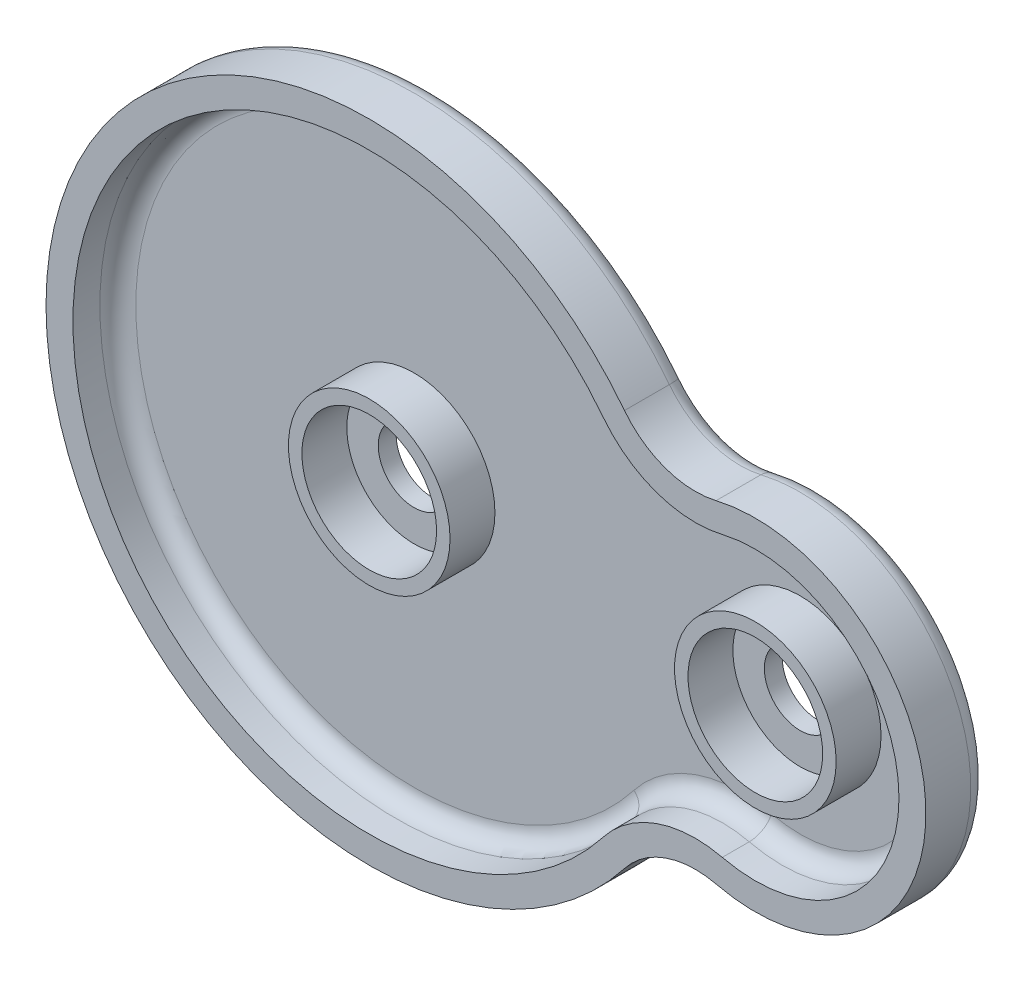
ISO-10303-21;
HEADER;
FILE_DESCRIPTION(('STEP AP214'),'2;1');
FILE_NAME('part.step','',(''),(''),'','','');
FILE_SCHEMA(('AUTOMOTIVE_DESIGN { 1 0 10303 214 1 1 1 1 }'));
ENDSEC;
DATA;
#1=APPLICATION_CONTEXT('core data for automotive mechanical design processes');
#2=APPLICATION_PROTOCOL_DEFINITION('international standard','automotive_design',2000,#1);
#3=PRODUCT_CONTEXT('',#1,'mechanical');
#4=PRODUCT('Part','Part','',(#3));
#5=PRODUCT_RELATED_PRODUCT_CATEGORY('part','',(#4));
#6=PRODUCT_DEFINITION_FORMATION('','',#4);
#7=PRODUCT_DEFINITION_CONTEXT('part definition',#1,'design');
#8=PRODUCT_DEFINITION('design','',#6,#7);
#9=PRODUCT_DEFINITION_SHAPE('','',#8);
#10=(LENGTH_UNIT() NAMED_UNIT(*) SI_UNIT(.MILLI.,.METRE.));
#11=(NAMED_UNIT(*) PLANE_ANGLE_UNIT() SI_UNIT($,.RADIAN.));
#12=(NAMED_UNIT(*) SI_UNIT($,.STERADIAN.) SOLID_ANGLE_UNIT());
#13=UNCERTAINTY_MEASURE_WITH_UNIT(LENGTH_MEASURE(1.E-05),#10,'distance_accuracy_value','');
#14=(GEOMETRIC_REPRESENTATION_CONTEXT(3) GLOBAL_UNCERTAINTY_ASSIGNED_CONTEXT((#13)) GLOBAL_UNIT_ASSIGNED_CONTEXT((#10,
#11,#12)) REPRESENTATION_CONTEXT('',''));
#15=CARTESIAN_POINT('',(0.,0.,0.));
#16=DIRECTION('',(0.,0.,1.));
#17=DIRECTION('',(1.,0.,0.));
#18=AXIS2_PLACEMENT_3D('',#15,#16,#17);
#19=CARTESIAN_POINT('',(0.,0.,2.));
#20=DIRECTION('',(0.,0.,1.));
#21=DIRECTION('',(1.,0.,0.));
#22=AXIS2_PLACEMENT_3D('',#19,#20,#21);
#23=PLANE('',#22);
#24=CARTESIAN_POINT('',(43.,0.,2.));
#25=DIRECTION('',(0.,0.,1.));
#26=DIRECTION('',(1.,0.,0.));
#27=AXIS2_PLACEMENT_3D('',#24,#25,#26);
#28=CIRCLE('',#27,4.);
#29=CARTESIAN_POINT('',(47.,0.,2.));
#30=VERTEX_POINT('',#29);
#31=EDGE_CURVE('E214',#30,#30,#28,.T.);
#32=ORIENTED_EDGE('',*,*,#31,.F.);
#33=EDGE_LOOP('',(#32));
#34=FACE_BOUND('',#33,.T.);
#35=CARTESIAN_POINT('',(43.,0.,2.));
#36=DIRECTION('',(0.,0.,1.));
#37=DIRECTION('',(1.,0.,0.));
#38=AXIS2_PLACEMENT_3D('',#35,#36,#37);
#39=CIRCLE('',#38,7.5);
#40=CARTESIAN_POINT('',(50.5,0.,2.));
#41=VERTEX_POINT('',#40);
#42=EDGE_CURVE('E196',#41,#41,#39,.F.);
#43=ORIENTED_EDGE('',*,*,#42,.F.);
#44=EDGE_LOOP('',(#43));
#45=FACE_BOUND('',#44,.T.);
#46=ADVANCED_FACE('F40',(#34,#45),#23,.T.);
#47=CARTESIAN_POINT('',(0.,0.,2.));
#48=DIRECTION('',(0.,0.,1.));
#49=DIRECTION('',(1.,0.,0.));
#50=AXIS2_PLACEMENT_3D('',#47,#48,#49);
#51=CIRCLE('',#50,4.);
#52=CARTESIAN_POINT('',(4.,0.,2.));
#53=VERTEX_POINT('',#52);
#54=EDGE_CURVE('E211',#53,#53,#51,.T.);
#55=ORIENTED_EDGE('',*,*,#54,.F.);
#56=EDGE_LOOP('',(#55));
#57=FACE_BOUND('',#56,.T.);
#58=CARTESIAN_POINT('',(0.,0.,2.));
#59=DIRECTION('',(0.,0.,1.));
#60=DIRECTION('',(1.,0.,0.));
#61=AXIS2_PLACEMENT_3D('',#58,#59,#60);
#62=CIRCLE('',#61,7.5);
#63=CARTESIAN_POINT('',(7.5,0.,2.));
#64=VERTEX_POINT('',#63);
#65=EDGE_CURVE('E141',#64,#64,#62,.F.);
#66=ORIENTED_EDGE('',*,*,#65,.F.);
#67=EDGE_LOOP('',(#66));
#68=FACE_BOUND('',#67,.T.);
#69=ADVANCED_FACE('F310',(#57,#68),#23,.T.);
#70=CARTESIAN_POINT('',(36.3255813953488,28.2214835947703,2.));
#71=DIRECTION('',(0.,0.,-1.));
#72=DIRECTION('',(-1.,0.,0.));
#73=AXIS2_PLACEMENT_3D('',#70,#71,#72);
#74=CYLINDRICAL_SURFACE('',#73,10.);
#75=DIRECTION('',(0.,0.,-1.));
#76=VECTOR('',#75,1.);
#77=CARTESIAN_POINT('',(38.6271050521251,18.4899375276081,2.));
#78=LINE('',#77,#76);
#79=CARTESIAN_POINT('',(38.6271050521251,18.4899375276081,7.));
#80=VERTEX_POINT('',#79);
#81=CARTESIAN_POINT('',(38.6271050521251,18.4899375276081,2.));
#82=VERTEX_POINT('',#81);
#83=EDGE_CURVE('E218',#80,#82,#78,.T.);
#84=ORIENTED_EDGE('',*,*,#83,.T.);
#85=CARTESIAN_POINT('',(36.3255813953488,28.2214835947703,2.));
#86=DIRECTION('',(0.,0.,1.));
#87=DIRECTION('',(1.,0.,0.));
#88=AXIS2_PLACEMENT_3D('',#85,#86,#87);
#89=CIRCLE('',#88,10.);
#90=CARTESIAN_POINT('',(28.4287158746208,22.0863784654724,2.));
#91=VERTEX_POINT('',#90);
#92=EDGE_CURVE('E138',#82,#91,#89,.F.);
#93=ORIENTED_EDGE('',*,*,#92,.T.);
#94=DIRECTION('',(0.,0.,-1.));
#95=VECTOR('',#94,1.);
#96=CARTESIAN_POINT('',(28.4287158746208,22.0863784654724,2.));
#97=LINE('',#96,#95);
#98=CARTESIAN_POINT('',(28.4287158746208,22.0863784654724,7.));
#99=VERTEX_POINT('',#98);
#100=EDGE_CURVE('E131',#99,#91,#97,.T.);
#101=ORIENTED_EDGE('',*,*,#100,.F.);
#102=CARTESIAN_POINT('',(36.3255813953488,28.2214835947703,7.));
#103=DIRECTION('',(0.,0.,1.));
#104=DIRECTION('',(1.,0.,0.));
#105=AXIS2_PLACEMENT_3D('',#102,#103,#104);
#106=CIRCLE('',#105,10.);
#107=EDGE_CURVE('E136',#99,#80,#106,.T.);
#108=ORIENTED_EDGE('',*,*,#107,.T.);
#109=EDGE_LOOP('',(#84,#93,#101,#108));
#110=FACE_BOUND('',#109,.T.);
#111=ADVANCED_FACE('F134',(#110),#74,.F.);
#112=CARTESIAN_POINT('',(0.,0.,2.));
#113=DIRECTION('',(0.,0.,-1.));
#114=DIRECTION('',(-1.,0.,0.));
#115=AXIS2_PLACEMENT_3D('',#112,#113,#114);
#116=CYLINDRICAL_SURFACE('',#115,36.);
#117=ORIENTED_EDGE('',*,*,#100,.T.);
#118=CARTESIAN_POINT('',(0.,0.,2.));
#119=DIRECTION('',(0.,0.,1.));
#120=DIRECTION('',(1.,0.,0.));
#121=AXIS2_PLACEMENT_3D('',#118,#119,#120);
#122=CIRCLE('',#121,36.);
#123=CARTESIAN_POINT('',(28.4287158746208,-22.0863784654724,2.));
#124=VERTEX_POINT('',#123);
#125=EDGE_CURVE('E239',#91,#124,#122,.T.);
#126=ORIENTED_EDGE('',*,*,#125,.T.);
#127=DIRECTION('',(0.,0.,-1.));
#128=VECTOR('',#127,1.);
#129=CARTESIAN_POINT('',(28.4287158746208,-22.0863784654724,2.));
#130=LINE('',#129,#128);
#131=CARTESIAN_POINT('',(28.4287158746208,-22.0863784654724,7.));
#132=VERTEX_POINT('',#131);
#133=EDGE_CURVE('E142',#132,#124,#130,.T.);
#134=ORIENTED_EDGE('',*,*,#133,.F.);
#135=CARTESIAN_POINT('',(0.,0.,7.));
#136=DIRECTION('',(0.,0.,1.));
#137=DIRECTION('',(1.,0.,0.));
#138=AXIS2_PLACEMENT_3D('',#135,#136,#137);
#139=CIRCLE('',#138,36.);
#140=EDGE_CURVE('E145',#99,#132,#139,.T.);
#141=ORIENTED_EDGE('',*,*,#140,.F.);
#142=EDGE_LOOP('',(#117,#126,#134,#141));
#143=FACE_BOUND('',#142,.T.);
#144=ADVANCED_FACE('F146',(#143),#116,.T.);
#145=CARTESIAN_POINT('',(36.3255813953488,-28.2214835947703,2.));
#146=DIRECTION('',(0.,0.,-1.));
#147=DIRECTION('',(-1.,0.,0.));
#148=AXIS2_PLACEMENT_3D('',#145,#146,#147);
#149=CYLINDRICAL_SURFACE('',#148,10.);
#150=ORIENTED_EDGE('',*,*,#133,.T.);
#151=CARTESIAN_POINT('',(36.3255813953488,-28.2214835947703,2.));
#152=DIRECTION('',(0.,0.,1.));
#153=DIRECTION('',(1.,0.,0.));
#154=AXIS2_PLACEMENT_3D('',#151,#152,#153);
#155=CIRCLE('',#154,10.);
#156=CARTESIAN_POINT('',(38.6271050521251,-18.4899375276081,2.));
#157=VERTEX_POINT('',#156);
#158=EDGE_CURVE('E199',#124,#157,#155,.F.);
#159=ORIENTED_EDGE('',*,*,#158,.T.);
#160=DIRECTION('',(0.,0.,-1.));
#161=VECTOR('',#160,1.);
#162=CARTESIAN_POINT('',(38.6271050521251,-18.4899375276081,2.));
#163=LINE('',#162,#161);
#164=CARTESIAN_POINT('',(38.6271050521251,-18.4899375276081,7.));
#165=VERTEX_POINT('',#164);
#166=EDGE_CURVE('E224',#165,#157,#163,.T.);
#167=ORIENTED_EDGE('',*,*,#166,.F.);
#168=CARTESIAN_POINT('',(36.3255813953488,-28.2214835947703,7.));
#169=DIRECTION('',(0.,0.,1.));
#170=DIRECTION('',(1.,0.,0.));
#171=AXIS2_PLACEMENT_3D('',#168,#169,#170);
#172=CIRCLE('',#171,10.);
#173=EDGE_CURVE('E151',#132,#165,#172,.F.);
#174=ORIENTED_EDGE('',*,*,#173,.F.);
#175=EDGE_LOOP('',(#150,#159,#167,#174));
#176=FACE_BOUND('',#175,.T.);
#177=ADVANCED_FACE('F342',(#176),#149,.F.);
#178=CARTESIAN_POINT('',(0.,0.,2.));
#179=DIRECTION('',(0.,0.,-1.));
#180=DIRECTION('',(-1.,0.,0.));
#181=AXIS2_PLACEMENT_3D('',#178,#179,#180);
#182=CYLINDRICAL_SURFACE('',#181,4.);
#183=ORIENTED_EDGE('',*,*,#54,.T.);
#184=EDGE_LOOP('',(#183));
#185=FACE_BOUND('',#184,.T.);
#186=CARTESIAN_POINT('',(0.,0.,0.));
#187=DIRECTION('',(0.,0.,1.));
#188=DIRECTION('',(1.,0.,0.));
#189=AXIS2_PLACEMENT_3D('',#186,#187,#188);
#190=CIRCLE('',#189,4.);
#191=CARTESIAN_POINT('',(4.,0.,0.));
#192=VERTEX_POINT('',#191);
#193=EDGE_CURVE('E208',#192,#192,#190,.T.);
#194=ORIENTED_EDGE('',*,*,#193,.F.);
#195=EDGE_LOOP('',(#194));
#196=FACE_BOUND('',#195,.T.);
#197=ADVANCED_FACE('F336',(#185,#196),#182,.F.);
#198=CARTESIAN_POINT('',(43.,0.,2.));
#199=DIRECTION('',(0.,0.,-1.));
#200=DIRECTION('',(-1.,0.,0.));
#201=AXIS2_PLACEMENT_3D('',#198,#199,#200);
#202=CYLINDRICAL_SURFACE('',#201,19.);
#203=ORIENTED_EDGE('',*,*,#166,.T.);
#204=CARTESIAN_POINT('',(43.,0.,2.));
#205=DIRECTION('',(0.,0.,1.));
#206=DIRECTION('',(1.,0.,0.));
#207=AXIS2_PLACEMENT_3D('',#204,#205,#206);
#208=CIRCLE('',#207,19.);
#209=EDGE_CURVE('E49',#157,#82,#208,.T.);
#210=ORIENTED_EDGE('',*,*,#209,.T.);
#211=ORIENTED_EDGE('',*,*,#83,.F.);
#212=CARTESIAN_POINT('',(43.,0.,7.));
#213=DIRECTION('',(0.,0.,1.));
#214=DIRECTION('',(1.,0.,0.));
#215=AXIS2_PLACEMENT_3D('',#212,#213,#214);
#216=CIRCLE('',#215,19.);
#217=EDGE_CURVE('E157',#165,#80,#216,.T.);
#218=ORIENTED_EDGE('',*,*,#217,.F.);
#219=EDGE_LOOP('',(#203,#210,#211,#218));
#220=FACE_BOUND('',#219,.T.);
#221=ADVANCED_FACE('F330',(#220),#202,.T.);
#222=CARTESIAN_POINT('',(43.,0.,2.));
#223=DIRECTION('',(0.,0.,-1.));
#224=DIRECTION('',(-1.,0.,0.));
#225=AXIS2_PLACEMENT_3D('',#222,#223,#224);
#226=CYLINDRICAL_SURFACE('',#225,4.);
#227=ORIENTED_EDGE('',*,*,#31,.T.);
#228=EDGE_LOOP('',(#227));
#229=FACE_BOUND('',#228,.T.);
#230=CARTESIAN_POINT('',(43.,0.,0.));
#231=DIRECTION('',(0.,0.,1.));
#232=DIRECTION('',(1.,0.,0.));
#233=AXIS2_PLACEMENT_3D('',#230,#231,#232);
#234=CIRCLE('',#233,4.);
#235=CARTESIAN_POINT('',(47.,0.,0.));
#236=VERTEX_POINT('',#235);
#237=EDGE_CURVE('E215',#236,#236,#234,.T.);
#238=ORIENTED_EDGE('',*,*,#237,.F.);
#239=EDGE_LOOP('',(#238));
#240=FACE_BOUND('',#239,.T.);
#241=ADVANCED_FACE('F323',(#229,#240),#226,.F.);
#242=CARTESIAN_POINT('',(0.,0.,2.));
#243=DIRECTION('',(0.,0.,1.));
#244=DIRECTION('',(1.,0.,0.));
#245=AXIS2_PLACEMENT_3D('',#242,#243,#244);
#246=CIRCLE('',#245,31.);
#247=CARTESIAN_POINT('',(24.4802831142568,19.0188259008234,2.));
#248=VERTEX_POINT('',#247);
#249=CARTESIAN_POINT('',(24.4802831142568,-19.0188259008234,2.));
#250=VERTEX_POINT('',#249);
#251=EDGE_CURVE('E245',#248,#250,#246,.T.);
#252=ORIENTED_EDGE('',*,*,#251,.T.);
#253=CARTESIAN_POINT('',(36.3255813953488,-28.2214835947703,2.));
#254=DIRECTION('',(0.,0.,1.));
#255=DIRECTION('',(1.,0.,0.));
#256=AXIS2_PLACEMENT_3D('',#253,#254,#255);
#257=CIRCLE('',#256,15.);
#258=CARTESIAN_POINT('',(39.7778668805132,-13.624164494027,2.));
#259=VERTEX_POINT('',#258);
#260=EDGE_CURVE('E251',#250,#259,#257,.F.);
#261=ORIENTED_EDGE('',*,*,#260,.T.);
#262=CARTESIAN_POINT('',(43.,0.,2.));
#263=DIRECTION('',(0.,0.,1.));
#264=DIRECTION('',(1.,0.,0.));
#265=AXIS2_PLACEMENT_3D('',#262,#263,#264);
#266=CIRCLE('',#265,14.);
#267=CARTESIAN_POINT('',(39.7778668805132,13.624164494027,2.));
#268=VERTEX_POINT('',#267);
#269=EDGE_CURVE('E249',#259,#268,#266,.T.);
#270=ORIENTED_EDGE('',*,*,#269,.T.);
#271=CARTESIAN_POINT('',(36.3255813953488,28.2214835947703,2.));
#272=DIRECTION('',(0.,0.,1.));
#273=DIRECTION('',(1.,0.,0.));
#274=AXIS2_PLACEMENT_3D('',#271,#272,#273);
#275=CIRCLE('',#274,15.);
#276=EDGE_CURVE('E247',#268,#248,#275,.F.);
#277=ORIENTED_EDGE('',*,*,#276,.T.);
#278=EDGE_LOOP('',(#252,#261,#270,#277));
#279=FACE_BOUND('',#278,.T.);
#280=CARTESIAN_POINT('',(43.,0.,2.));
#281=DIRECTION('',(0.,0.,1.));
#282=DIRECTION('',(1.,0.,0.));
#283=AXIS2_PLACEMENT_3D('',#280,#281,#282);
#284=CIRCLE('',#283,9.);
#285=CARTESIAN_POINT('',(52.,0.,2.));
#286=VERTEX_POINT('',#285);
#287=EDGE_CURVE('E192',#286,#286,#284,.F.);
#288=ORIENTED_EDGE('',*,*,#287,.T.);
#289=EDGE_LOOP('',(#288));
#290=FACE_BOUND('',#289,.T.);
#291=CARTESIAN_POINT('',(0.,0.,2.));
#292=DIRECTION('',(0.,0.,1.));
#293=DIRECTION('',(1.,0.,0.));
#294=AXIS2_PLACEMENT_3D('',#291,#292,#293);
#295=CIRCLE('',#294,9.);
#296=CARTESIAN_POINT('',(9.,0.,2.));
#297=VERTEX_POINT('',#296);
#298=EDGE_CURVE('E205',#297,#297,#295,.F.);
#299=ORIENTED_EDGE('',*,*,#298,.T.);
#300=EDGE_LOOP('',(#299));
#301=FACE_BOUND('',#300,.T.);
#302=ADVANCED_FACE('F282',(#279,#290,#301),#23,.T.);
#303=CARTESIAN_POINT('',(0.,0.,0.));
#304=DIRECTION('',(0.,0.,1.));
#305=DIRECTION('',(1.,0.,0.));
#306=AXIS2_PLACEMENT_3D('',#303,#304,#305);
#307=PLANE('',#306);
#308=CARTESIAN_POINT('',(43.,0.,0.));
#309=DIRECTION('',(0.,0.,1.));
#310=DIRECTION('',(1.,0.,0.));
#311=AXIS2_PLACEMENT_3D('',#308,#309,#310);
#312=CIRCLE('',#311,17.);
#313=CARTESIAN_POINT('',(39.0874097834804,16.5436283141757,0.));
#314=VERTEX_POINT('',#313);
#315=CARTESIAN_POINT('',(39.0874097834803,-16.5436283141757,0.));
#316=VERTEX_POINT('',#315);
#317=EDGE_CURVE('E230',#314,#316,#312,.F.);
#318=ORIENTED_EDGE('',*,*,#317,.T.);
#319=CARTESIAN_POINT('',(36.3255813953488,-28.2214835947703,0.));
#320=DIRECTION('',(0.,0.,1.));
#321=DIRECTION('',(1.,0.,0.));
#322=AXIS2_PLACEMENT_3D('',#319,#320,#321);
#323=CIRCLE('',#322,12.);
#324=CARTESIAN_POINT('',(26.8493427704752,-20.8593574396128,0.));
#325=VERTEX_POINT('',#324);
#326=EDGE_CURVE('E236',#316,#325,#323,.T.);
#327=ORIENTED_EDGE('',*,*,#326,.T.);
#328=CARTESIAN_POINT('',(0.,0.,0.));
#329=DIRECTION('',(0.,0.,1.));
#330=DIRECTION('',(1.,0.,0.));
#331=AXIS2_PLACEMENT_3D('',#328,#329,#330);
#332=CIRCLE('',#331,34.);
#333=CARTESIAN_POINT('',(26.8493427704752,20.8593574396128,0.));
#334=VERTEX_POINT('',#333);
#335=EDGE_CURVE('E234',#325,#334,#332,.F.);
#336=ORIENTED_EDGE('',*,*,#335,.T.);
#337=CARTESIAN_POINT('',(36.3255813953488,28.2214835947703,0.));
#338=DIRECTION('',(0.,0.,1.));
#339=DIRECTION('',(1.,0.,0.));
#340=AXIS2_PLACEMENT_3D('',#337,#338,#339);
#341=CIRCLE('',#340,12.);
#342=EDGE_CURVE('E232',#334,#314,#341,.T.);
#343=ORIENTED_EDGE('',*,*,#342,.T.);
#344=EDGE_LOOP('',(#318,#327,#336,#343));
#345=FACE_BOUND('',#344,.T.);
#346=ORIENTED_EDGE('',*,*,#193,.T.);
#347=EDGE_LOOP('',(#346));
#348=FACE_BOUND('',#347,.T.);
#349=ORIENTED_EDGE('',*,*,#237,.T.);
#350=EDGE_LOOP('',(#349));
#351=FACE_BOUND('',#350,.T.);
#352=ADVANCED_FACE('F322',(#345,#348,#351),#307,.F.);
#353=CARTESIAN_POINT('',(0.,0.,7.));
#354=DIRECTION('',(0.,0.,-1.));
#355=DIRECTION('',(-1.,0.,0.));
#356=AXIS2_PLACEMENT_3D('',#353,#354,#355);
#357=CYLINDRICAL_SURFACE('',#356,7.5);
#358=ORIENTED_EDGE('',*,*,#65,.T.);
#359=EDGE_LOOP('',(#358));
#360=FACE_BOUND('',#359,.T.);
#361=CARTESIAN_POINT('',(0.,0.,7.));
#362=DIRECTION('',(0.,0.,1.));
#363=DIRECTION('',(1.,0.,0.));
#364=AXIS2_PLACEMENT_3D('',#361,#362,#363);
#365=CIRCLE('',#364,7.5);
#366=CARTESIAN_POINT('',(7.5,0.,7.));
#367=VERTEX_POINT('',#366);
#368=EDGE_CURVE('E195',#367,#367,#365,.T.);
#369=ORIENTED_EDGE('',*,*,#368,.T.);
#370=EDGE_LOOP('',(#369));
#371=FACE_BOUND('',#370,.T.);
#372=ADVANCED_FACE('F328',(#360,#371),#357,.F.);
#373=CARTESIAN_POINT('',(0.,0.,7.));
#374=DIRECTION('',(0.,0.,-1.));
#375=DIRECTION('',(-1.,0.,0.));
#376=AXIS2_PLACEMENT_3D('',#373,#374,#375);
#377=CYLINDRICAL_SURFACE('',#376,9.);
#378=ORIENTED_EDGE('',*,*,#298,.F.);
#379=EDGE_LOOP('',(#378));
#380=FACE_BOUND('',#379,.T.);
#381=CARTESIAN_POINT('',(0.,0.,7.));
#382=DIRECTION('',(0.,0.,1.));
#383=DIRECTION('',(1.,0.,0.));
#384=AXIS2_PLACEMENT_3D('',#381,#382,#383);
#385=CIRCLE('',#384,9.);
#386=CARTESIAN_POINT('',(9.,0.,7.));
#387=VERTEX_POINT('',#386);
#388=EDGE_CURVE('E202',#387,#387,#385,.T.);
#389=ORIENTED_EDGE('',*,*,#388,.F.);
#390=EDGE_LOOP('',(#389));
#391=FACE_BOUND('',#390,.T.);
#392=ADVANCED_FACE('F486',(#380,#391),#377,.T.);
#393=CARTESIAN_POINT('',(0.,0.,7.));
#394=DIRECTION('',(0.,0.,1.));
#395=DIRECTION('',(1.,0.,0.));
#396=AXIS2_PLACEMENT_3D('',#393,#394,#395);
#397=PLANE('',#396);
#398=ORIENTED_EDGE('',*,*,#368,.F.);
#399=EDGE_LOOP('',(#398));
#400=FACE_BOUND('',#399,.T.);
#401=ORIENTED_EDGE('',*,*,#388,.T.);
#402=EDGE_LOOP('',(#401));
#403=FACE_BOUND('',#402,.T.);
#404=ADVANCED_FACE('F496',(#400,#403),#397,.T.);
#405=CARTESIAN_POINT('',(43.,0.,7.));
#406=DIRECTION('',(0.,0.,-1.));
#407=DIRECTION('',(-1.,0.,0.));
#408=AXIS2_PLACEMENT_3D('',#405,#406,#407);
#409=CYLINDRICAL_SURFACE('',#408,7.5);
#410=ORIENTED_EDGE('',*,*,#42,.T.);
#411=EDGE_LOOP('',(#410));
#412=FACE_BOUND('',#411,.T.);
#413=CARTESIAN_POINT('',(43.,0.,7.));
#414=DIRECTION('',(0.,0.,1.));
#415=DIRECTION('',(1.,0.,0.));
#416=AXIS2_PLACEMENT_3D('',#413,#414,#415);
#417=CIRCLE('',#416,7.5);
#418=CARTESIAN_POINT('',(50.5,0.,7.));
#419=VERTEX_POINT('',#418);
#420=EDGE_CURVE('E186',#419,#419,#417,.T.);
#421=ORIENTED_EDGE('',*,*,#420,.T.);
#422=EDGE_LOOP('',(#421));
#423=FACE_BOUND('',#422,.T.);
#424=ADVANCED_FACE('F507',(#412,#423),#409,.F.);
#425=CARTESIAN_POINT('',(43.,0.,7.));
#426=DIRECTION('',(0.,0.,-1.));
#427=DIRECTION('',(-1.,0.,0.));
#428=AXIS2_PLACEMENT_3D('',#425,#426,#427);
#429=CYLINDRICAL_SURFACE('',#428,9.);
#430=ORIENTED_EDGE('',*,*,#287,.F.);
#431=EDGE_LOOP('',(#430));
#432=FACE_BOUND('',#431,.T.);
#433=CARTESIAN_POINT('',(43.,0.,7.));
#434=DIRECTION('',(0.,0.,1.));
#435=DIRECTION('',(1.,0.,0.));
#436=AXIS2_PLACEMENT_3D('',#433,#434,#435);
#437=CIRCLE('',#436,9.);
#438=CARTESIAN_POINT('',(52.,0.,7.));
#439=VERTEX_POINT('',#438);
#440=EDGE_CURVE('E189',#439,#439,#437,.T.);
#441=ORIENTED_EDGE('',*,*,#440,.F.);
#442=EDGE_LOOP('',(#441));
#443=FACE_BOUND('',#442,.T.);
#444=ADVANCED_FACE('F518',(#432,#443),#429,.T.);
#445=CARTESIAN_POINT('',(0.,0.,7.));
#446=DIRECTION('',(0.,0.,1.));
#447=DIRECTION('',(1.,0.,0.));
#448=AXIS2_PLACEMENT_3D('',#445,#446,#447);
#449=PLANE('',#448);
#450=ORIENTED_EDGE('',*,*,#420,.F.);
#451=EDGE_LOOP('',(#450));
#452=FACE_BOUND('',#451,.T.);
#453=ORIENTED_EDGE('',*,*,#440,.T.);
#454=EDGE_LOOP('',(#453));
#455=FACE_BOUND('',#454,.T.);
#456=ADVANCED_FACE('F307',(#452,#455),#449,.T.);
#457=CARTESIAN_POINT('',(0.,0.,7.));
#458=DIRECTION('',(0.,0.,-1.));
#459=DIRECTION('',(-1.,0.,0.));
#460=AXIS2_PLACEMENT_3D('',#457,#458,#459);
#461=CYLINDRICAL_SURFACE('',#460,33.);
#462=DIRECTION('',(0.,0.,-1.));
#463=VECTOR('',#462,1.);
#464=CARTESIAN_POINT('',(26.0596562184024,-20.245846926683,7.));
#465=LINE('',#464,#463);
#466=CARTESIAN_POINT('',(26.0596562184024,-20.245846926683,7.));
#467=VERTEX_POINT('',#466);
#468=CARTESIAN_POINT('',(26.0596562184024,-20.245846926683,4.));
#469=VERTEX_POINT('',#468);
#470=EDGE_CURVE('E177',#467,#469,#465,.T.);
#471=ORIENTED_EDGE('',*,*,#470,.T.);
#472=CARTESIAN_POINT('',(0.,0.,4.));
#473=DIRECTION('',(0.,0.,1.));
#474=DIRECTION('',(1.,0.,0.));
#475=AXIS2_PLACEMENT_3D('',#472,#473,#474);
#476=CIRCLE('',#475,33.);
#477=CARTESIAN_POINT('',(26.0596562184024,20.245846926683,4.));
#478=VERTEX_POINT('',#477);
#479=EDGE_CURVE('E11',#469,#478,#476,.F.);
#480=ORIENTED_EDGE('',*,*,#479,.T.);
#481=DIRECTION('',(0.,0.,-1.));
#482=VECTOR('',#481,1.);
#483=CARTESIAN_POINT('',(26.0596562184024,20.245846926683,7.));
#484=LINE('',#483,#482);
#485=CARTESIAN_POINT('',(26.0596562184024,20.245846926683,7.));
#486=VERTEX_POINT('',#485);
#487=EDGE_CURVE('E184',#486,#478,#484,.T.);
#488=ORIENTED_EDGE('',*,*,#487,.F.);
#489=CARTESIAN_POINT('',(0.,0.,7.));
#490=DIRECTION('',(0.,0.,1.));
#491=DIRECTION('',(1.,0.,0.));
#492=AXIS2_PLACEMENT_3D('',#489,#490,#491);
#493=CIRCLE('',#492,33.);
#494=EDGE_CURVE('E166',#486,#467,#493,.T.);
#495=ORIENTED_EDGE('',*,*,#494,.T.);
#496=EDGE_LOOP('',(#471,#480,#488,#495));
#497=FACE_BOUND('',#496,.T.);
#498=ADVANCED_FACE('F292',(#497),#461,.F.);
#499=CARTESIAN_POINT('',(36.3255813953488,28.2214835947703,7.));
#500=DIRECTION('',(0.,0.,-1.));
#501=DIRECTION('',(-1.,0.,0.));
#502=AXIS2_PLACEMENT_3D('',#499,#500,#501);
#503=CYLINDRICAL_SURFACE('',#502,13.);
#504=ORIENTED_EDGE('',*,*,#487,.T.);
#505=CARTESIAN_POINT('',(36.3255813953488,28.2214835947703,4.));
#506=DIRECTION('',(0.,0.,1.));
#507=DIRECTION('',(1.,0.,0.));
#508=AXIS2_PLACEMENT_3D('',#505,#506,#507);
#509=CIRCLE('',#508,13.);
#510=CARTESIAN_POINT('',(39.317562149158,15.5704737074594,4.));
#511=VERTEX_POINT('',#510);
#512=EDGE_CURVE('E62',#478,#511,#509,.T.);
#513=ORIENTED_EDGE('',*,*,#512,.T.);
#514=DIRECTION('',(0.,0.,-1.));
#515=VECTOR('',#514,1.);
#516=CARTESIAN_POINT('',(39.317562149158,15.5704737074594,7.));
#517=LINE('',#516,#515);
#518=CARTESIAN_POINT('',(39.317562149158,15.5704737074594,7.));
#519=VERTEX_POINT('',#518);
#520=EDGE_CURVE('E182',#519,#511,#517,.T.);
#521=ORIENTED_EDGE('',*,*,#520,.F.);
#522=CARTESIAN_POINT('',(36.3255813953488,28.2214835947703,7.));
#523=DIRECTION('',(0.,0.,1.));
#524=DIRECTION('',(1.,0.,0.));
#525=AXIS2_PLACEMENT_3D('',#522,#523,#524);
#526=CIRCLE('',#525,13.);
#527=EDGE_CURVE('E169',#486,#519,#526,.T.);
#528=ORIENTED_EDGE('',*,*,#527,.F.);
#529=EDGE_LOOP('',(#504,#513,#521,#528));
#530=FACE_BOUND('',#529,.T.);
#531=ADVANCED_FACE('F299',(#530),#503,.T.);
#532=CARTESIAN_POINT('',(43.,0.,7.));
#533=DIRECTION('',(0.,0.,-1.));
#534=DIRECTION('',(-1.,0.,0.));
#535=AXIS2_PLACEMENT_3D('',#532,#533,#534);
#536=CYLINDRICAL_SURFACE('',#535,16.);
#537=ORIENTED_EDGE('',*,*,#520,.T.);
#538=CARTESIAN_POINT('',(43.,0.,4.));
#539=DIRECTION('',(0.,0.,1.));
#540=DIRECTION('',(1.,0.,0.));
#541=AXIS2_PLACEMENT_3D('',#538,#539,#540);
#542=CIRCLE('',#541,16.);
#543=CARTESIAN_POINT('',(39.317562149158,-15.5704737074595,4.));
#544=VERTEX_POINT('',#543);
#545=EDGE_CURVE('E254',#511,#544,#542,.F.);
#546=ORIENTED_EDGE('',*,*,#545,.T.);
#547=DIRECTION('',(0.,0.,-1.));
#548=VECTOR('',#547,1.);
#549=CARTESIAN_POINT('',(39.317562149158,-15.5704737074595,7.));
#550=LINE('',#549,#548);
#551=CARTESIAN_POINT('',(39.317562149158,-15.5704737074595,7.));
#552=VERTEX_POINT('',#551);
#553=EDGE_CURVE('E179',#552,#544,#550,.T.);
#554=ORIENTED_EDGE('',*,*,#553,.F.);
#555=CARTESIAN_POINT('',(43.,0.,7.));
#556=DIRECTION('',(0.,0.,1.));
#557=DIRECTION('',(1.,0.,0.));
#558=AXIS2_PLACEMENT_3D('',#555,#556,#557);
#559=CIRCLE('',#558,16.);
#560=EDGE_CURVE('E171',#552,#519,#559,.T.);
#561=ORIENTED_EDGE('',*,*,#560,.T.);
#562=EDGE_LOOP('',(#537,#546,#554,#561));
#563=FACE_BOUND('',#562,.T.);
#564=ADVANCED_FACE('F298',(#563),#536,.F.);
#565=CARTESIAN_POINT('',(36.3255813953488,-28.2214835947703,7.));
#566=DIRECTION('',(0.,0.,-1.));
#567=DIRECTION('',(-1.,0.,0.));
#568=AXIS2_PLACEMENT_3D('',#565,#566,#567);
#569=CYLINDRICAL_SURFACE('',#568,13.);
#570=ORIENTED_EDGE('',*,*,#553,.T.);
#571=CARTESIAN_POINT('',(36.3255813953488,-28.2214835947703,4.));
#572=DIRECTION('',(0.,0.,1.));
#573=DIRECTION('',(1.,0.,0.));
#574=AXIS2_PLACEMENT_3D('',#571,#572,#573);
#575=CIRCLE('',#574,13.);
#576=EDGE_CURVE('E242',#544,#469,#575,.T.);
#577=ORIENTED_EDGE('',*,*,#576,.T.);
#578=ORIENTED_EDGE('',*,*,#470,.F.);
#579=CARTESIAN_POINT('',(36.3255813953488,-28.2214835947703,7.));
#580=DIRECTION('',(0.,0.,1.));
#581=DIRECTION('',(1.,0.,0.));
#582=AXIS2_PLACEMENT_3D('',#579,#580,#581);
#583=CIRCLE('',#582,13.);
#584=EDGE_CURVE('E174',#467,#552,#583,.F.);
#585=ORIENTED_EDGE('',*,*,#584,.T.);
#586=EDGE_LOOP('',(#570,#577,#578,#585));
#587=FACE_BOUND('',#586,.T.);
#588=ADVANCED_FACE('F291',(#587),#569,.T.);
#589=CARTESIAN_POINT('',(0.,0.,7.));
#590=DIRECTION('',(0.,0.,1.));
#591=DIRECTION('',(1.,0.,0.));
#592=AXIS2_PLACEMENT_3D('',#589,#590,#591);
#593=PLANE('',#592);
#594=ORIENTED_EDGE('',*,*,#107,.F.);
#595=ORIENTED_EDGE('',*,*,#140,.T.);
#596=ORIENTED_EDGE('',*,*,#173,.T.);
#597=ORIENTED_EDGE('',*,*,#217,.T.);
#598=EDGE_LOOP('',(#594,#595,#596,#597));
#599=FACE_BOUND('',#598,.T.);
#600=ORIENTED_EDGE('',*,*,#494,.F.);
#601=ORIENTED_EDGE('',*,*,#527,.T.);
#602=ORIENTED_EDGE('',*,*,#560,.F.);
#603=ORIENTED_EDGE('',*,*,#584,.F.);
#604=EDGE_LOOP('',(#600,#601,#602,#603));
#605=FACE_BOUND('',#604,.T.);
#606=ADVANCED_FACE('F154',(#599,#605),#593,.T.);
#607=CARTESIAN_POINT('',(36.3255813953488,28.2214835947703,2.));
#608=DIRECTION('',(0.,0.,1.));
#609=DIRECTION('',(1.,0.,0.));
#610=AXIS2_PLACEMENT_3D('',#607,#608,#609);
#611=TOROIDAL_SURFACE('',#610,12.,2.);
#612=CARTESIAN_POINT('',(39.0874097834804,16.5436283141757,2.));
#613=DIRECTION('',(0.973154606716215,0.230152365677628,0.));
#614=DIRECTION('',(-0.230152365677628,0.973154606716215,0.));
#615=AXIS2_PLACEMENT_3D('',#612,#613,#614);
#616=CIRCLE('',#615,2.);
#617=EDGE_CURVE('E161',#314,#82,#616,.T.);
#618=ORIENTED_EDGE('',*,*,#617,.F.);
#619=ORIENTED_EDGE('',*,*,#342,.F.);
#620=CARTESIAN_POINT('',(26.8493427704752,20.8593574396128,2.));
#621=DIRECTION('',(-0.613510512929788,0.789686552072801,0.));
#622=DIRECTION('',(-0.789686552072801,-0.613510512929788,0.));
#623=AXIS2_PLACEMENT_3D('',#620,#621,#622);
#624=CIRCLE('',#623,2.);
#625=EDGE_CURVE('E158',#91,#334,#624,.T.);
#626=ORIENTED_EDGE('',*,*,#625,.F.);
#627=ORIENTED_EDGE('',*,*,#92,.F.);
#628=EDGE_LOOP('',(#618,#619,#626,#627));
#629=FACE_BOUND('',#628,.T.);
#630=ADVANCED_FACE('F363',(#629),#611,.T.);
#631=CARTESIAN_POINT('',(0.,0.,2.));
#632=DIRECTION('',(0.,0.,1.));
#633=DIRECTION('',(1.,0.,0.));
#634=AXIS2_PLACEMENT_3D('',#631,#632,#633);
#635=TOROIDAL_SURFACE('',#634,34.,2.);
#636=ORIENTED_EDGE('',*,*,#625,.T.);
#637=ORIENTED_EDGE('',*,*,#335,.F.);
#638=CARTESIAN_POINT('',(26.8493427704752,-20.8593574396128,2.));
#639=DIRECTION('',(0.613510512929788,0.7896865520728,0.));
#640=DIRECTION('',(-0.789686552072801,0.613510512929789,0.));
#641=AXIS2_PLACEMENT_3D('',#638,#639,#640);
#642=CIRCLE('',#641,2.);
#643=EDGE_CURVE('E260',#124,#325,#642,.T.);
#644=ORIENTED_EDGE('',*,*,#643,.F.);
#645=ORIENTED_EDGE('',*,*,#125,.F.);
#646=EDGE_LOOP('',(#636,#637,#644,#645));
#647=FACE_BOUND('',#646,.T.);
#648=ADVANCED_FACE('F359',(#647),#635,.T.);
#649=CARTESIAN_POINT('',(43.,0.,2.));
#650=DIRECTION('',(0.,0.,1.));
#651=DIRECTION('',(1.,0.,0.));
#652=AXIS2_PLACEMENT_3D('',#649,#650,#651);
#653=TOROIDAL_SURFACE('',#652,17.,2.);
#654=ORIENTED_EDGE('',*,*,#617,.T.);
#655=ORIENTED_EDGE('',*,*,#209,.F.);
#656=CARTESIAN_POINT('',(39.0874097834803,-16.5436283141757,2.));
#657=DIRECTION('',(-0.973154606716216,0.230152365677624,0.));
#658=DIRECTION('',(-0.230152365677624,-0.973154606716216,0.));
#659=AXIS2_PLACEMENT_3D('',#656,#657,#658);
#660=CIRCLE('',#659,2.);
#661=EDGE_CURVE('E258',#316,#157,#660,.T.);
#662=ORIENTED_EDGE('',*,*,#661,.F.);
#663=ORIENTED_EDGE('',*,*,#317,.F.);
#664=EDGE_LOOP('',(#654,#655,#662,#663));
#665=FACE_BOUND('',#664,.T.);
#666=ADVANCED_FACE('F355',(#665),#653,.T.);
#667=CARTESIAN_POINT('',(36.3255813953488,-28.2214835947703,2.));
#668=DIRECTION('',(0.,0.,1.));
#669=DIRECTION('',(1.,0.,0.));
#670=AXIS2_PLACEMENT_3D('',#667,#668,#669);
#671=TOROIDAL_SURFACE('',#670,12.,2.);
#672=ORIENTED_EDGE('',*,*,#643,.T.);
#673=ORIENTED_EDGE('',*,*,#326,.F.);
#674=ORIENTED_EDGE('',*,*,#661,.T.);
#675=ORIENTED_EDGE('',*,*,#158,.F.);
#676=EDGE_LOOP('',(#672,#673,#674,#675));
#677=FACE_BOUND('',#676,.T.);
#678=ADVANCED_FACE('F352',(#677),#671,.T.);
#679=CARTESIAN_POINT('',(36.3255813953488,28.2214835947703,4.));
#680=DIRECTION('',(0.,0.,1.));
#681=DIRECTION('',(1.,0.,0.));
#682=AXIS2_PLACEMENT_3D('',#679,#680,#681);
#683=TOROIDAL_SURFACE('',#682,15.,2.);
#684=CARTESIAN_POINT('',(24.4802831142568,19.0188259008234,4.));
#685=DIRECTION('',(0.613510512929788,-0.7896865520728,0.));
#686=DIRECTION('',(0.789686552072801,0.613510512929789,0.));
#687=AXIS2_PLACEMENT_3D('',#684,#685,#686);
#688=CIRCLE('',#687,2.);
#689=EDGE_CURVE('E267',#248,#478,#688,.T.);
#690=ORIENTED_EDGE('',*,*,#689,.F.);
#691=ORIENTED_EDGE('',*,*,#276,.F.);
#692=CARTESIAN_POINT('',(39.7778668805132,13.624164494027,4.));
#693=DIRECTION('',(-0.973154606716216,-0.230152365677624,0.));
#694=DIRECTION('',(0.230152365677624,-0.973154606716216,0.));
#695=AXIS2_PLACEMENT_3D('',#692,#693,#694);
#696=CIRCLE('',#695,2.);
#697=EDGE_CURVE('E44',#511,#268,#696,.T.);
#698=ORIENTED_EDGE('',*,*,#697,.F.);
#699=ORIENTED_EDGE('',*,*,#512,.F.);
#700=EDGE_LOOP('',(#690,#691,#698,#699));
#701=FACE_BOUND('',#700,.T.);
#702=ADVANCED_FACE('F42',(#701),#683,.F.);
#703=CARTESIAN_POINT('',(43.,0.,4.));
#704=DIRECTION('',(0.,0.,1.));
#705=DIRECTION('',(1.,0.,0.));
#706=AXIS2_PLACEMENT_3D('',#703,#704,#705);
#707=TOROIDAL_SURFACE('',#706,14.,2.);
#708=ORIENTED_EDGE('',*,*,#697,.T.);
#709=ORIENTED_EDGE('',*,*,#269,.F.);
#710=CARTESIAN_POINT('',(39.7778668805132,-13.624164494027,4.));
#711=DIRECTION('',(0.973154606716216,-0.230152365677624,0.));
#712=DIRECTION('',(0.230152365677624,0.973154606716216,0.));
#713=AXIS2_PLACEMENT_3D('',#710,#711,#712);
#714=CIRCLE('',#713,2.);
#715=EDGE_CURVE('E266',#544,#259,#714,.T.);
#716=ORIENTED_EDGE('',*,*,#715,.F.);
#717=ORIENTED_EDGE('',*,*,#545,.F.);
#718=EDGE_LOOP('',(#708,#709,#716,#717));
#719=FACE_BOUND('',#718,.T.);
#720=ADVANCED_FACE('F277',(#719),#707,.F.);
#721=CARTESIAN_POINT('',(0.,0.,4.));
#722=DIRECTION('',(0.,0.,1.));
#723=DIRECTION('',(1.,0.,0.));
#724=AXIS2_PLACEMENT_3D('',#721,#722,#723);
#725=TOROIDAL_SURFACE('',#724,31.,2.);
#726=ORIENTED_EDGE('',*,*,#689,.T.);
#727=ORIENTED_EDGE('',*,*,#479,.F.);
#728=CARTESIAN_POINT('',(24.4802831142568,-19.0188259008234,4.));
#729=DIRECTION('',(-0.613510512929788,-0.789686552072801,0.));
#730=DIRECTION('',(0.789686552072801,-0.613510512929788,0.));
#731=AXIS2_PLACEMENT_3D('',#728,#729,#730);
#732=CIRCLE('',#731,2.);
#733=EDGE_CURVE('E264',#250,#469,#732,.T.);
#734=ORIENTED_EDGE('',*,*,#733,.F.);
#735=ORIENTED_EDGE('',*,*,#251,.F.);
#736=EDGE_LOOP('',(#726,#727,#734,#735));
#737=FACE_BOUND('',#736,.T.);
#738=ADVANCED_FACE('F289',(#737),#725,.F.);
#739=CARTESIAN_POINT('',(36.3255813953488,-28.2214835947703,4.));
#740=DIRECTION('',(0.,0.,1.));
#741=DIRECTION('',(1.,0.,0.));
#742=AXIS2_PLACEMENT_3D('',#739,#740,#741);
#743=TOROIDAL_SURFACE('',#742,15.,2.);
#744=ORIENTED_EDGE('',*,*,#715,.T.);
#745=ORIENTED_EDGE('',*,*,#260,.F.);
#746=ORIENTED_EDGE('',*,*,#733,.T.);
#747=ORIENTED_EDGE('',*,*,#576,.F.);
#748=EDGE_LOOP('',(#744,#745,#746,#747));
#749=FACE_BOUND('',#748,.T.);
#750=ADVANCED_FACE('F287',(#749),#743,.F.);
#751=CLOSED_SHELL('',(#46,#69,#111,#144,#177,#197,#221,#241,#302,#352,#372,#392,#404,#424,#444,
#456,#498,#531,#564,#588,#606,#630,#648,#666,#678,#702,#720,#738,#750));
#752=MANIFOLD_SOLID_BREP('B2',#751);
#753=ADVANCED_BREP_SHAPE_REPRESENTATION('',(#18,#752),#14);
#754=SHAPE_DEFINITION_REPRESENTATION(#9,#753);
ENDSEC;
END-ISO-10303-21;
